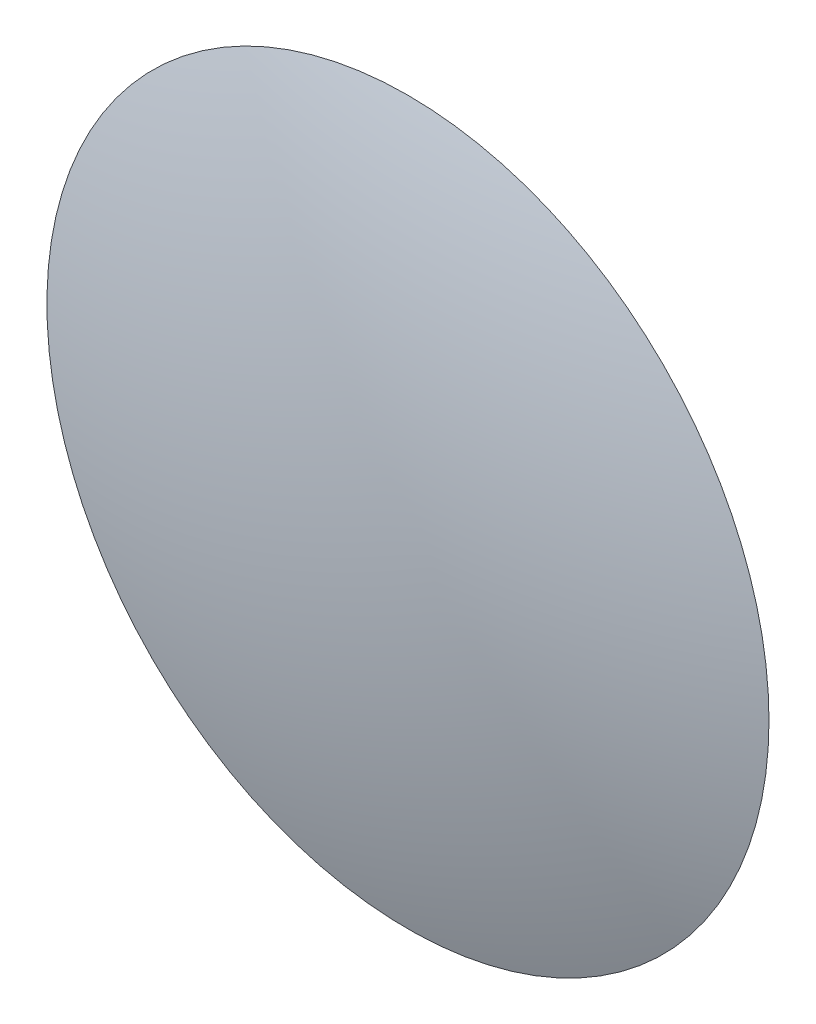
ISO-10303-21;
HEADER;
FILE_DESCRIPTION(('STEP AP214'),'2;1');
FILE_NAME('part.step','',(''),(''),'','','');
FILE_SCHEMA(('AUTOMOTIVE_DESIGN { 1 0 10303 214 1 1 1 1 }'));
ENDSEC;
DATA;
#1=APPLICATION_CONTEXT('core data for automotive mechanical design processes');
#2=APPLICATION_PROTOCOL_DEFINITION('international standard','automotive_design',2000,#1);
#3=PRODUCT_CONTEXT('',#1,'mechanical');
#4=PRODUCT('Part','Part','',(#3));
#5=PRODUCT_RELATED_PRODUCT_CATEGORY('part','',(#4));
#6=PRODUCT_DEFINITION_FORMATION('','',#4);
#7=PRODUCT_DEFINITION_CONTEXT('part definition',#1,'design');
#8=PRODUCT_DEFINITION('design','',#6,#7);
#9=PRODUCT_DEFINITION_SHAPE('','',#8);
#10=(LENGTH_UNIT() NAMED_UNIT(*) SI_UNIT(.MILLI.,.METRE.));
#11=(NAMED_UNIT(*) PLANE_ANGLE_UNIT() SI_UNIT($,.RADIAN.));
#12=(NAMED_UNIT(*) SI_UNIT($,.STERADIAN.) SOLID_ANGLE_UNIT());
#13=UNCERTAINTY_MEASURE_WITH_UNIT(LENGTH_MEASURE(1.E-05),#10,'distance_accuracy_value','');
#14=(GEOMETRIC_REPRESENTATION_CONTEXT(3) GLOBAL_UNCERTAINTY_ASSIGNED_CONTEXT((#13)) GLOBAL_UNIT_ASSIGNED_CONTEXT((#10,
#11,#12)) REPRESENTATION_CONTEXT('',''));
#15=CARTESIAN_POINT('',(0.,0.,0.));
#16=DIRECTION('',(0.,0.,1.));
#17=DIRECTION('',(1.,0.,0.));
#18=AXIS2_PLACEMENT_3D('',#15,#16,#17);
#19=CARTESIAN_POINT('',(0.,0.,52.5));
#20=DIRECTION('',(0.,0.,1.));
#21=DIRECTION('',(0.,1.,0.));
#22=AXIS2_PLACEMENT_3D('',#19,#20,#21);
#23=SPHERICAL_SURFACE('',#22,55.1454043869478);
#24=CARTESIAN_POINT('',(0.,0.,0.));
#25=DIRECTION('',(0.,0.,1.));
#26=DIRECTION('',(1.,0.,0.));
#27=AXIS2_PLACEMENT_3D('',#24,#25,#26);
#28=CIRCLE('',#27,16.875);
#29=CARTESIAN_POINT('',(16.875,0.,0.));
#30=VERTEX_POINT('',#29);
#31=EDGE_CURVE('E10',#30,#30,#28,.T.);
#32=ORIENTED_EDGE('',*,*,#31,.F.);
#33=EDGE_LOOP('',(#32));
#34=FACE_BOUND('',#33,.T.);
#35=ADVANCED_FACE('F34',(#34),#23,.T.);
#36=CARTESIAN_POINT('',(0.,0.,-52.5));
#37=DIRECTION('',(0.,0.,-1.));
#38=DIRECTION('',(0.,1.,0.));
#39=AXIS2_PLACEMENT_3D('',#36,#37,#38);
#40=SPHERICAL_SURFACE('',#39,55.1454043869478);
#41=ORIENTED_EDGE('',*,*,#31,.T.);
#42=EDGE_LOOP('',(#41));
#43=FACE_BOUND('',#42,.T.);
#44=ADVANCED_FACE('F41',(#43),#40,.T.);
#45=CLOSED_SHELL('',(#35,#44));
#46=MANIFOLD_SOLID_BREP('B2',#45);
#47=ADVANCED_BREP_SHAPE_REPRESENTATION('',(#18,#46),#14);
#48=SHAPE_DEFINITION_REPRESENTATION(#9,#47);
ENDSEC;
END-ISO-10303-21;
